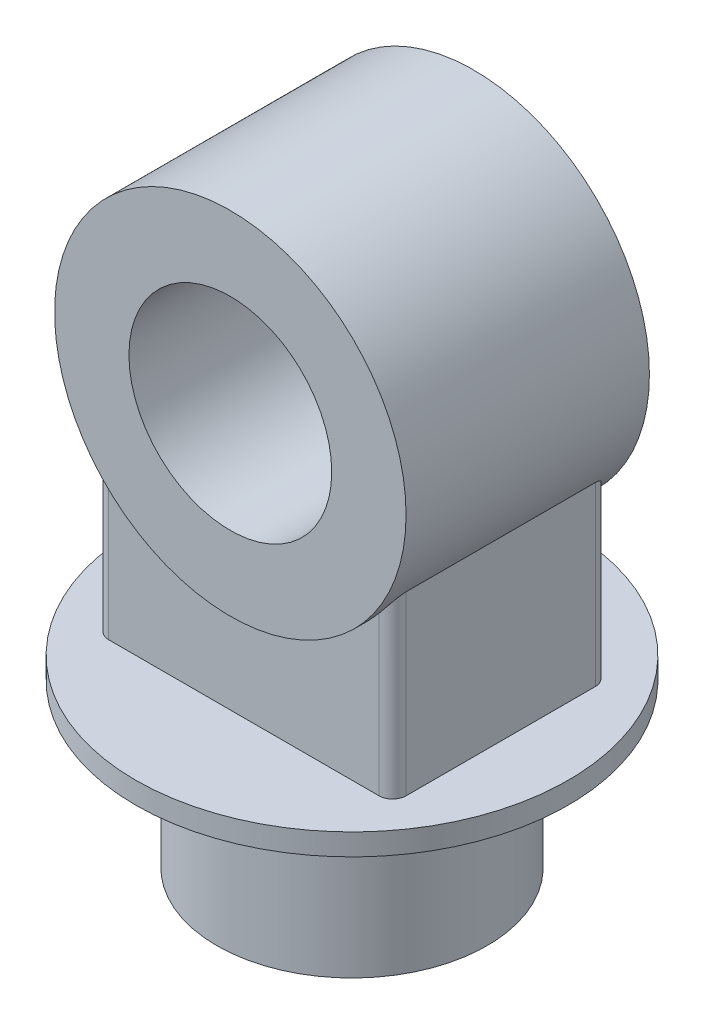
ISO-10303-21;
HEADER;
FILE_DESCRIPTION(('STEP AP214'),'2;1');
FILE_NAME('part.step','',(''),(''),'','','');
FILE_SCHEMA(('AUTOMOTIVE_DESIGN { 1 0 10303 214 1 1 1 1 }'));
ENDSEC;
DATA;
#1=APPLICATION_CONTEXT('core data for automotive mechanical design processes');
#2=APPLICATION_PROTOCOL_DEFINITION('international standard','automotive_design',2000,#1);
#3=PRODUCT_CONTEXT('',#1,'mechanical');
#4=PRODUCT('Part','Part','',(#3));
#5=PRODUCT_RELATED_PRODUCT_CATEGORY('part','',(#4));
#6=PRODUCT_DEFINITION_FORMATION('','',#4);
#7=PRODUCT_DEFINITION_CONTEXT('part definition',#1,'design');
#8=PRODUCT_DEFINITION('design','',#6,#7);
#9=PRODUCT_DEFINITION_SHAPE('','',#8);
#10=(LENGTH_UNIT() NAMED_UNIT(*) SI_UNIT(.MILLI.,.METRE.));
#11=(NAMED_UNIT(*) PLANE_ANGLE_UNIT() SI_UNIT($,.RADIAN.));
#12=(NAMED_UNIT(*) SI_UNIT($,.STERADIAN.) SOLID_ANGLE_UNIT());
#13=UNCERTAINTY_MEASURE_WITH_UNIT(LENGTH_MEASURE(1.E-05),#10,'distance_accuracy_value','');
#14=(GEOMETRIC_REPRESENTATION_CONTEXT(3) GLOBAL_UNCERTAINTY_ASSIGNED_CONTEXT((#13)) GLOBAL_UNIT_ASSIGNED_CONTEXT((#10,
#11,#12)) REPRESENTATION_CONTEXT('',''));
#15=CARTESIAN_POINT('',(0.,0.,0.));
#16=DIRECTION('',(0.,0.,1.));
#17=DIRECTION('',(1.,0.,0.));
#18=AXIS2_PLACEMENT_3D('',#15,#16,#17);
#19=CARTESIAN_POINT('',(0.,120.,0.));
#20=DIRECTION('',(0.,-1.,0.));
#21=DIRECTION('',(0.,0.,-1.));
#22=AXIS2_PLACEMENT_3D('',#19,#20,#21);
#23=CYLINDRICAL_SURFACE('',#22,100.);
#24=CARTESIAN_POINT('',(0.,120.,0.));
#25=DIRECTION('',(0.,1.,0.));
#26=DIRECTION('',(0.,0.,1.));
#27=AXIS2_PLACEMENT_3D('',#24,#25,#26);
#28=CIRCLE('',#27,100.);
#29=CARTESIAN_POINT('',(0.,120.,100.));
#30=VERTEX_POINT('',#29);
#31=EDGE_CURVE('E141',#30,#30,#28,.T.);
#32=ORIENTED_EDGE('',*,*,#31,.F.);
#33=EDGE_LOOP('',(#32));
#34=FACE_BOUND('',#33,.T.);
#35=CARTESIAN_POINT('',(0.,0.,0.));
#36=DIRECTION('',(0.,1.,0.));
#37=DIRECTION('',(0.,0.,1.));
#38=AXIS2_PLACEMENT_3D('',#35,#36,#37);
#39=CIRCLE('',#38,100.);
#40=CARTESIAN_POINT('',(0.,0.,100.));
#41=VERTEX_POINT('',#40);
#42=EDGE_CURVE('E218',#41,#41,#39,.T.);
#43=ORIENTED_EDGE('',*,*,#42,.T.);
#44=EDGE_LOOP('',(#43));
#45=FACE_BOUND('',#44,.T.);
#46=ADVANCED_FACE('F39',(#34,#45),#23,.T.);
#47=CARTESIAN_POINT('',(0.,0.,0.));
#48=DIRECTION('',(0.,1.,0.));
#49=DIRECTION('',(0.,0.,1.));
#50=AXIS2_PLACEMENT_3D('',#47,#48,#49);
#51=PLANE('',#50);
#52=ORIENTED_EDGE('',*,*,#42,.F.);
#53=EDGE_LOOP('',(#52));
#54=FACE_BOUND('',#53,.T.);
#55=ADVANCED_FACE('F206',(#54),#51,.F.);
#56=CARTESIAN_POINT('',(0.,136.,0.));
#57=DIRECTION('',(0.,-1.,0.));
#58=DIRECTION('',(0.,0.,-1.));
#59=AXIS2_PLACEMENT_3D('',#56,#57,#58);
#60=CYLINDRICAL_SURFACE('',#59,160.);
#61=CARTESIAN_POINT('',(0.,136.,0.));
#62=DIRECTION('',(0.,1.,0.));
#63=DIRECTION('',(0.,0.,1.));
#64=AXIS2_PLACEMENT_3D('',#61,#62,#63);
#65=CIRCLE('',#64,160.);
#66=CARTESIAN_POINT('',(0.,136.,160.));
#67=VERTEX_POINT('',#66);
#68=EDGE_CURVE('E219',#67,#67,#65,.T.);
#69=ORIENTED_EDGE('',*,*,#68,.F.);
#70=EDGE_LOOP('',(#69));
#71=FACE_BOUND('',#70,.T.);
#72=CARTESIAN_POINT('',(0.,120.,0.));
#73=DIRECTION('',(0.,1.,0.));
#74=DIRECTION('',(0.,0.,1.));
#75=AXIS2_PLACEMENT_3D('',#72,#73,#74);
#76=CIRCLE('',#75,160.);
#77=CARTESIAN_POINT('',(0.,120.,160.));
#78=VERTEX_POINT('',#77);
#79=EDGE_CURVE('E222',#78,#78,#76,.T.);
#80=ORIENTED_EDGE('',*,*,#79,.T.);
#81=EDGE_LOOP('',(#80));
#82=FACE_BOUND('',#81,.T.);
#83=ADVANCED_FACE('F211',(#71,#82),#60,.T.);
#84=CARTESIAN_POINT('',(0.,136.,0.));
#85=DIRECTION('',(0.,1.,0.));
#86=DIRECTION('',(0.,0.,1.));
#87=AXIS2_PLACEMENT_3D('',#84,#85,#86);
#88=PLANE('',#87);
#89=DIRECTION('',(0.,0.,-1.));
#90=VECTOR('',#89,1.);
#91=CARTESIAN_POINT('',(110.,136.,-80.));
#92=LINE('',#91,#90);
#93=CARTESIAN_POINT('',(110.,136.,70.));
#94=VERTEX_POINT('',#93);
#95=CARTESIAN_POINT('',(110.,136.,-70.));
#96=VERTEX_POINT('',#95);
#97=EDGE_CURVE('E226',#94,#96,#92,.T.);
#98=ORIENTED_EDGE('',*,*,#97,.F.);
#99=CARTESIAN_POINT('',(100.,136.,70.));
#100=DIRECTION('',(0.,1.,0.));
#101=DIRECTION('',(0.,0.,1.));
#102=AXIS2_PLACEMENT_3D('',#99,#100,#101);
#103=CIRCLE('',#102,10.);
#104=CARTESIAN_POINT('',(100.,136.,80.));
#105=VERTEX_POINT('',#104);
#106=EDGE_CURVE('E122',#94,#105,#103,.F.);
#107=ORIENTED_EDGE('',*,*,#106,.T.);
#108=DIRECTION('',(1.,0.,0.));
#109=VECTOR('',#108,1.);
#110=CARTESIAN_POINT('',(-110.,136.,80.));
#111=LINE('',#110,#109);
#112=CARTESIAN_POINT('',(-100.,136.,80.));
#113=VERTEX_POINT('',#112);
#114=EDGE_CURVE('E231',#113,#105,#111,.T.);
#115=ORIENTED_EDGE('',*,*,#114,.F.);
#116=CARTESIAN_POINT('',(-100.,136.,70.));
#117=DIRECTION('',(0.,1.,0.));
#118=DIRECTION('',(0.,0.,1.));
#119=AXIS2_PLACEMENT_3D('',#116,#117,#118);
#120=CIRCLE('',#119,10.);
#121=CARTESIAN_POINT('',(-110.,136.,70.));
#122=VERTEX_POINT('',#121);
#123=EDGE_CURVE('E53',#113,#122,#120,.F.);
#124=ORIENTED_EDGE('',*,*,#123,.T.);
#125=DIRECTION('',(0.,0.,1.));
#126=VECTOR('',#125,1.);
#127=CARTESIAN_POINT('',(-110.,136.,-80.));
#128=LINE('',#127,#126);
#129=CARTESIAN_POINT('',(-110.,136.,-70.));
#130=VERTEX_POINT('',#129);
#131=EDGE_CURVE('E234',#130,#122,#128,.T.);
#132=ORIENTED_EDGE('',*,*,#131,.F.);
#133=CARTESIAN_POINT('',(-100.,136.,-70.));
#134=DIRECTION('',(0.,1.,0.));
#135=DIRECTION('',(0.,0.,1.));
#136=AXIS2_PLACEMENT_3D('',#133,#134,#135);
#137=CIRCLE('',#136,10.);
#138=CARTESIAN_POINT('',(-100.,136.,-80.));
#139=VERTEX_POINT('',#138);
#140=EDGE_CURVE('E67',#130,#139,#137,.F.);
#141=ORIENTED_EDGE('',*,*,#140,.T.);
#142=DIRECTION('',(-1.,0.,0.));
#143=VECTOR('',#142,1.);
#144=CARTESIAN_POINT('',(-110.,136.,-80.));
#145=LINE('',#144,#143);
#146=CARTESIAN_POINT('',(100.,136.,-80.));
#147=VERTEX_POINT('',#146);
#148=EDGE_CURVE('E132',#147,#139,#145,.T.);
#149=ORIENTED_EDGE('',*,*,#148,.F.);
#150=CARTESIAN_POINT('',(100.,136.,-70.));
#151=DIRECTION('',(0.,1.,0.));
#152=DIRECTION('',(0.,0.,1.));
#153=AXIS2_PLACEMENT_3D('',#150,#151,#152);
#154=CIRCLE('',#153,10.);
#155=EDGE_CURVE('E121',#147,#96,#154,.F.);
#156=ORIENTED_EDGE('',*,*,#155,.T.);
#157=EDGE_LOOP('',(#98,#107,#115,#124,#132,#141,#149,#156));
#158=FACE_BOUND('',#157,.T.);
#159=ORIENTED_EDGE('',*,*,#68,.T.);
#160=EDGE_LOOP('',(#159));
#161=FACE_BOUND('',#160,.T.);
#162=ADVANCED_FACE('F348',(#158,#161),#88,.T.);
#163=CARTESIAN_POINT('',(0.,120.,0.));
#164=DIRECTION('',(0.,1.,0.));
#165=DIRECTION('',(0.,0.,1.));
#166=AXIS2_PLACEMENT_3D('',#163,#164,#165);
#167=PLANE('',#166);
#168=ORIENTED_EDGE('',*,*,#31,.T.);
#169=EDGE_LOOP('',(#168));
#170=FACE_BOUND('',#169,.T.);
#171=ORIENTED_EDGE('',*,*,#79,.F.);
#172=EDGE_LOOP('',(#171));
#173=FACE_BOUND('',#172,.T.);
#174=ADVANCED_FACE('F325',(#170,#173),#167,.F.);
#175=CARTESIAN_POINT('',(-110.,466.002,-80.));
#176=DIRECTION('',(0.,0.,1.));
#177=DIRECTION('',(1.,0.,0.));
#178=AXIS2_PLACEMENT_3D('',#175,#176,#177);
#179=PLANE('',#178);
#180=CARTESIAN_POINT('',(0.,336.,-80.));
#181=DIRECTION('',(0.,0.,1.));
#182=DIRECTION('',(1.,0.,0.));
#183=AXIS2_PLACEMENT_3D('',#180,#181,#182);
#184=CIRCLE('',#183,130.);
#185=CARTESIAN_POINT('',(100.,252.933761370819,-80.));
#186=VERTEX_POINT('',#185);
#187=CARTESIAN_POINT('',(-100.,252.933761370819,-80.));
#188=VERTEX_POINT('',#187);
#189=EDGE_CURVE('E133',#186,#188,#184,.F.);
#190=ORIENTED_EDGE('',*,*,#189,.F.);
#191=DIRECTION('',(0.,-1.,0.));
#192=VECTOR('',#191,1.);
#193=CARTESIAN_POINT('',(100.,466.002,-80.));
#194=LINE('',#193,#192);
#195=EDGE_CURVE('E148',#186,#147,#194,.T.);
#196=ORIENTED_EDGE('',*,*,#195,.T.);
#197=ORIENTED_EDGE('',*,*,#148,.T.);
#198=DIRECTION('',(0.,-1.,0.));
#199=VECTOR('',#198,1.);
#200=CARTESIAN_POINT('',(-100.,466.002,-80.));
#201=LINE('',#200,#199);
#202=EDGE_CURVE('E146',#139,#188,#201,.F.);
#203=ORIENTED_EDGE('',*,*,#202,.T.);
#204=EDGE_LOOP('',(#190,#196,#197,#203));
#205=FACE_BOUND('',#204,.T.);
#206=ADVANCED_FACE('F318',(#205),#179,.F.);
#207=CARTESIAN_POINT('',(110.,466.002,-80.));
#208=DIRECTION('',(-1.,0.,0.));
#209=DIRECTION('',(0.,0.,1.));
#210=AXIS2_PLACEMENT_3D('',#207,#208,#209);
#211=PLANE('',#210);
#212=DIRECTION('',(0.,0.,-1.));
#213=VECTOR('',#212,1.);
#214=CARTESIAN_POINT('',(110.,266.717967697245,90.));
#215=LINE('',#214,#213);
#216=CARTESIAN_POINT('',(110.,266.717967697245,70.));
#217=VERTEX_POINT('',#216);
#218=CARTESIAN_POINT('',(110.,266.717967697245,-69.9999999999999));
#219=VERTEX_POINT('',#218);
#220=EDGE_CURVE('E114',#217,#219,#215,.T.);
#221=ORIENTED_EDGE('',*,*,#220,.F.);
#222=DIRECTION('',(0.,-1.,0.));
#223=VECTOR('',#222,1.);
#224=CARTESIAN_POINT('',(110.,466.002,70.));
#225=LINE('',#224,#223);
#226=EDGE_CURVE('E128',#217,#94,#225,.T.);
#227=ORIENTED_EDGE('',*,*,#226,.T.);
#228=ORIENTED_EDGE('',*,*,#97,.T.);
#229=DIRECTION('',(0.,-1.,0.));
#230=VECTOR('',#229,1.);
#231=CARTESIAN_POINT('',(110.,466.002,-70.));
#232=LINE('',#231,#230);
#233=EDGE_CURVE('E131',#96,#219,#232,.F.);
#234=ORIENTED_EDGE('',*,*,#233,.T.);
#235=EDGE_LOOP('',(#221,#227,#228,#234));
#236=FACE_BOUND('',#235,.T.);
#237=ADVANCED_FACE('F126',(#236),#211,.F.);
#238=CARTESIAN_POINT('',(-110.,466.002,-80.));
#239=DIRECTION('',(1.,0.,0.));
#240=DIRECTION('',(0.,0.,-1.));
#241=AXIS2_PLACEMENT_3D('',#238,#239,#240);
#242=PLANE('',#241);
#243=DIRECTION('',(0.,0.,-1.));
#244=VECTOR('',#243,1.);
#245=CARTESIAN_POINT('',(-110.,266.717967697245,90.));
#246=LINE('',#245,#244);
#247=CARTESIAN_POINT('',(-110.,266.717967697245,-70.));
#248=VERTEX_POINT('',#247);
#249=CARTESIAN_POINT('',(-110.,266.717967697245,70.));
#250=VERTEX_POINT('',#249);
#251=EDGE_CURVE('E193',#248,#250,#246,.F.);
#252=ORIENTED_EDGE('',*,*,#251,.F.);
#253=DIRECTION('',(0.,-1.,0.));
#254=VECTOR('',#253,1.);
#255=CARTESIAN_POINT('',(-110.,466.002,-70.));
#256=LINE('',#255,#254);
#257=EDGE_CURVE('E153',#248,#130,#256,.T.);
#258=ORIENTED_EDGE('',*,*,#257,.T.);
#259=ORIENTED_EDGE('',*,*,#131,.T.);
#260=DIRECTION('',(0.,-1.,0.));
#261=VECTOR('',#260,1.);
#262=CARTESIAN_POINT('',(-110.,466.002,70.));
#263=LINE('',#262,#261);
#264=EDGE_CURVE('E151',#122,#250,#263,.F.);
#265=ORIENTED_EDGE('',*,*,#264,.T.);
#266=EDGE_LOOP('',(#252,#258,#259,#265));
#267=FACE_BOUND('',#266,.T.);
#268=ADVANCED_FACE('F197',(#267),#242,.F.);
#269=CARTESIAN_POINT('',(-110.,466.002,80.));
#270=DIRECTION('',(0.,0.,-1.));
#271=DIRECTION('',(-1.,0.,0.));
#272=AXIS2_PLACEMENT_3D('',#269,#270,#271);
#273=PLANE('',#272);
#274=ORIENTED_EDGE('',*,*,#114,.T.);
#275=DIRECTION('',(0.,-1.,0.));
#276=VECTOR('',#275,1.);
#277=CARTESIAN_POINT('',(100.,466.002,80.));
#278=LINE('',#277,#276);
#279=CARTESIAN_POINT('',(100.,252.933761370819,80.));
#280=VERTEX_POINT('',#279);
#281=EDGE_CURVE('E139',#105,#280,#278,.F.);
#282=ORIENTED_EDGE('',*,*,#281,.T.);
#283=CARTESIAN_POINT('',(0.,336.,80.));
#284=DIRECTION('',(0.,0.,-1.));
#285=DIRECTION('',(-1.,0.,0.));
#286=AXIS2_PLACEMENT_3D('',#283,#284,#285);
#287=CIRCLE('',#286,130.);
#288=CARTESIAN_POINT('',(-100.,252.933761370819,80.));
#289=VERTEX_POINT('',#288);
#290=EDGE_CURVE('E117',#289,#280,#287,.F.);
#291=ORIENTED_EDGE('',*,*,#290,.F.);
#292=DIRECTION('',(0.,-1.,0.));
#293=VECTOR('',#292,1.);
#294=CARTESIAN_POINT('',(-100.,466.002,80.));
#295=LINE('',#294,#293);
#296=EDGE_CURVE('E136',#289,#113,#295,.T.);
#297=ORIENTED_EDGE('',*,*,#296,.T.);
#298=EDGE_LOOP('',(#274,#282,#291,#297));
#299=FACE_BOUND('',#298,.T.);
#300=ADVANCED_FACE('F263',(#299),#273,.F.);
#301=CARTESIAN_POINT('',(0.,336.,90.));
#302=DIRECTION('',(0.,0.,-1.));
#303=DIRECTION('',(-1.,0.,0.));
#304=AXIS2_PLACEMENT_3D('',#301,#302,#303);
#305=CYLINDRICAL_SURFACE('',#304,130.);
#306=CARTESIAN_POINT('',(0.,336.,90.));
#307=DIRECTION('',(0.,0.,1.));
#308=DIRECTION('',(1.,0.,0.));
#309=AXIS2_PLACEMENT_3D('',#306,#307,#308);
#310=CIRCLE('',#309,130.);
#311=CARTESIAN_POINT('',(130.,336.,90.));
#312=VERTEX_POINT('',#311);
#313=EDGE_CURVE('E228',#312,#312,#310,.T.);
#314=ORIENTED_EDGE('',*,*,#313,.F.);
#315=EDGE_LOOP('',(#314));
#316=FACE_BOUND('',#315,.T.);
#317=CARTESIAN_POINT('',(0.,336.,-90.));
#318=DIRECTION('',(0.,0.,1.));
#319=DIRECTION('',(1.,0.,0.));
#320=AXIS2_PLACEMENT_3D('',#317,#318,#319);
#321=CIRCLE('',#320,130.);
#322=CARTESIAN_POINT('',(130.,336.,-90.));
#323=VERTEX_POINT('',#322);
#324=EDGE_CURVE('E239',#323,#323,#321,.T.);
#325=ORIENTED_EDGE('',*,*,#324,.T.);
#326=EDGE_LOOP('',(#325));
#327=FACE_BOUND('',#326,.T.);
#328=ORIENTED_EDGE('',*,*,#290,.T.);
#329=CARTESIAN_POINT('',(100.,252.933761370819,80.));
#330=CARTESIAN_POINT('',(100.223611151915,253.202952503255,79.9999830665315));
#331=CARTESIAN_POINT('',(100.446118360057,253.473036166024,79.9924995885085));
#332=CARTESIAN_POINT('',(100.888548742496,254.014496760122,79.9629173131463));
#333=CARTESIAN_POINT('',(101.108472043759,254.285873626978,79.9408192370116));
#334=CARTESIAN_POINT('',(101.545586290072,254.829711400373,79.8822979337703));
#335=CARTESIAN_POINT('',(101.76277446753,255.102173087004,79.8458612385231));
#336=CARTESIAN_POINT('',(102.193849033468,255.647413797012,79.7588609087488));
#337=CARTESIAN_POINT('',(102.407735374993,255.920192824843,79.7082970735217));
#338=CARTESIAN_POINT('',(103.048408055095,256.74400885936,79.5343891784366));
#339=CARTESIAN_POINT('',(103.469748368072,257.294974230618,79.3894263280958));
#340=CARTESIAN_POINT('',(104.088382224678,258.117224843771,79.1288060997198));
#341=CARTESIAN_POINT('',(104.292337034927,258.39057162742,79.0347525474725));
#342=CARTESIAN_POINT('',(104.695498702643,258.935304765081,78.8319429710982));
#343=CARTESIAN_POINT('',(104.894706004332,259.206691300842,78.7231883289499));
#344=CARTESIAN_POINT('',(105.336170271764,259.812965668139,78.4620472638272));
#345=CARTESIAN_POINT('',(105.577006541077,260.147108038148,78.3055009036513));
#346=CARTESIAN_POINT('',(106.049660949871,260.809343252621,77.967808626391));
#347=CARTESIAN_POINT('',(106.281479043935,261.137436066616,77.7866625854443));
#348=CARTESIAN_POINT('',(106.734152264033,261.784259610706,77.3986376161628));
#349=CARTESIAN_POINT('',(106.955036134368,262.103013877598,77.1918317878757));
#350=CARTESIAN_POINT('',(107.384708325122,262.728803605627,76.749894392022));
#351=CARTESIAN_POINT('',(107.593501627276,263.035843875289,76.5147746155492));
#352=CARTESIAN_POINT('',(107.921279015409,263.522080966666,76.1068757916446));
#353=CARTESIAN_POINT('',(108.044709884718,263.706240813682,75.9435605188263));
#354=CARTESIAN_POINT('',(108.284949666933,264.066582834907,75.6038296157538));
#355=CARTESIAN_POINT('',(108.401760304956,264.242767084986,75.4274174262628));
#356=CARTESIAN_POINT('',(108.627683741988,264.585236991633,75.0605773993746));
#357=CARTESIAN_POINT('',(108.736797961361,264.751524473746,74.8701521613912));
#358=CARTESIAN_POINT('',(108.945874410432,265.071634412635,74.4745306992528));
#359=CARTESIAN_POINT('',(109.04583974995,265.225461102935,74.2693395369045));
#360=CARTESIAN_POINT('',(109.274660386151,265.579056080623,73.7536743100227));
#361=CARTESIAN_POINT('',(109.398046362816,265.771031349643,73.4351396850742));
#362=CARTESIAN_POINT('',(109.561336457207,266.026263049992,72.9345418523035));
#363=CARTESIAN_POINT('',(109.612072269395,266.105785634321,72.7641622498837));
#364=CARTESIAN_POINT('',(109.705421847597,266.25239837099,72.4160328323222));
#365=CARTESIAN_POINT('',(109.748040656091,266.319496241142,72.2382876769632));
#366=CARTESIAN_POINT('',(109.820262744001,266.433384610412,71.8947331689276));
#367=CARTESIAN_POINT('',(109.850752312767,266.481551609067,71.729567610939));
#368=CARTESIAN_POINT('',(109.903691363628,266.565274678987,71.3948451418076));
#369=CARTESIAN_POINT('',(109.926143541964,266.600834979285,71.2252897238033));
#370=CARTESIAN_POINT('',(109.962659042777,266.658707696818,70.8807814271977));
#371=CARTESIAN_POINT('',(109.976613864032,266.680848750137,70.7057875562757));
#372=CARTESIAN_POINT('',(109.99061964662,266.703076138542,70.4419386674803));
#373=CARTESIAN_POINT('',(109.99413386492,266.708654625171,70.3536902139711));
#374=CARTESIAN_POINT('',(109.998824989492,266.716102079045,70.1769662160103));
#375=CARTESIAN_POINT('',(110.000001659485,266.717970671296,70.088490649507));
#376=CARTESIAN_POINT('',(110.,266.717967697245,70.));
#377=B_SPLINE_CURVE_WITH_KNOTS('',3,(#329,#330,#331,#332,#333,#334,#335,#336,#337,#338,#339,
#340,#341,#342,#343,#344,#345,#346,#347,#348,#349,#350,#351,#352,#353,#354,#355,#356,#357,#358,
#359,#360,#361,#362,#363,#364,#365,#366,#367,#368,#369,#370,#371,#372,#373,#374,#375,#376),
.UNSPECIFIED.,.F.,.F.,(4,2,2,2,2,2,2,2,2,2,2,2,2,2,2,2,2,2,2,2,2,2,2,4),(0.,1.04974156507773,
2.0994313311457,3.15010942417266,4.20080244462032,6.32356278933856,7.38465211465323,
8.44564176134495,9.76677685539396,11.087918601761,12.4053795382949,13.7222937149077,
14.5479419827463,15.3733741023698,16.1986534888326,17.023651302289,18.194686650492,
18.7783719827905,19.3616935243415,19.8852298594992,20.408590403038,20.9385006934629,
21.2038887699912,21.4693036704869),.UNSPECIFIED.);
#378=EDGE_CURVE('E111',#280,#217,#377,.T.);
#379=ORIENTED_EDGE('',*,*,#378,.T.);
#380=ORIENTED_EDGE('',*,*,#220,.T.);
#381=CARTESIAN_POINT('',(110.,266.717967697245,-70.));
#382=CARTESIAN_POINT('',(110.000033683462,266.718025852698,-70.1614230595313));
#383=CARTESIAN_POINT('',(109.996092792414,266.711764254296,-70.3228118197691));
#384=CARTESIAN_POINT('',(109.980519982779,266.687045880384,-70.6441123999957));
#385=CARTESIAN_POINT('',(109.968896213713,266.668602027069,-70.8040256031146));
#386=CARTESIAN_POINT('',(109.938376398954,266.620217986395,-71.1196424551221));
#387=CARTESIAN_POINT('',(109.919558261622,266.590400967593,-71.2753727040436));
#388=CARTESIAN_POINT('',(109.875071558334,266.52000006118,-71.5834085562726));
#389=CARTESIAN_POINT('',(109.849400846184,266.479412800404,-71.7357130704249));
#390=CARTESIAN_POINT('',(109.784772267017,266.377386983169,-72.0722520040974));
#391=CARTESIAN_POINT('',(109.744103525393,266.313281105855,-72.2553511890568));
#392=CARTESIAN_POINT('',(109.654040532803,266.171650231929,-72.6141464391851));
#393=CARTESIAN_POINT('',(109.604640075501,266.094115691273,-72.7898371277864));
#394=CARTESIAN_POINT('',(109.497968805892,265.927147418338,-73.133872391345));
#395=CARTESIAN_POINT('',(109.440667457039,265.837667562915,-73.302184951541));
#396=CARTESIAN_POINT('',(109.319341126161,265.648779195145,-73.6304969218558));
#397=CARTESIAN_POINT('',(109.25531768694,265.549372961282,-73.7904982269664));
#398=CARTESIAN_POINT('',(109.085069343255,265.285901292919,-74.1868876463209));
#399=CARTESIAN_POINT('',(108.974781990569,265.115997241409,-74.4176642111939));
#400=CARTESIAN_POINT('',(108.742772943656,264.76058359918,-74.8607110351426));
#401=CARTESIAN_POINT('',(108.621044869784,264.575065307649,-75.072970840064));
#402=CARTESIAN_POINT('',(108.36794946479,264.19164129378,-75.4804206329535));
#403=CARTESIAN_POINT('',(108.236568322626,263.993717884812,-75.6755852518652));
#404=CARTESIAN_POINT('',(107.965814499919,263.588382733387,-76.0497203250662));
#405=CARTESIAN_POINT('',(107.826442440892,263.380971729107,-76.2286920360201));
#406=CARTESIAN_POINT('',(107.56145650763,262.989174407744,-76.5468161797372));
#407=CARTESIAN_POINT('',(107.436764821801,262.805791987749,-76.6879854690674));
#408=CARTESIAN_POINT('',(107.182869679799,262.434497987953,-76.9599552926783));
#409=CARTESIAN_POINT('',(107.053665586411,262.24658576965,-77.0907543539386));
#410=CARTESIAN_POINT('',(106.659844344167,261.677121003612,-77.4685356621902));
#411=CARTESIAN_POINT('',(106.389102445143,261.289965080353,-77.7008024816961));
#412=CARTESIAN_POINT('',(105.833418194946,260.504836154638,-78.129863631631));
#413=CARTESIAN_POINT('',(105.548442441802,260.106838810795,-78.3265689888296));
#414=CARTESIAN_POINT('',(104.96676628824,259.304344779382,-78.6860846955172));
#415=CARTESIAN_POINT('',(104.670068038633,258.899849292081,-78.8489012287858));
#416=CARTESIAN_POINT('',(104.024574509401,258.030646711215,-79.1623550419402));
#417=CARTESIAN_POINT('',(103.674248758637,257.565348460988,-79.3081944572228));
#418=CARTESIAN_POINT('',(102.961876677953,256.632523338709,-79.558756520093));
#419=CARTESIAN_POINT('',(102.599828734006,256.16499616738,-79.6634734792563));
#420=CARTESIAN_POINT('',(102.051092736822,255.466397204689,-79.7891645729388));
#421=CARTESIAN_POINT('',(101.868137468165,255.235094848973,-79.8257282191264));
#422=CARTESIAN_POINT('',(101.499966150616,254.77288550036,-79.8886289353229));
#423=CARTESIAN_POINT('',(101.314750133026,254.541978502041,-79.9149661467555));
#424=CARTESIAN_POINT('',(100.942320486513,254.080919722901,-79.9572665465168));
#425=CARTESIAN_POINT('',(100.755107350153,253.850767773367,-79.9732322353467));
#426=CARTESIAN_POINT('',(100.378860262163,253.391449185777,-79.9945948234744));
#427=CARTESIAN_POINT('',(100.189826234412,253.162282589497,-79.9999912789888));
#428=CARTESIAN_POINT('',(99.9999999999999,252.933761370819,-80.));
#429=B_SPLINE_CURVE_WITH_KNOTS('',3,(#381,#382,#383,#384,#385,#386,#387,#388,#389,#390,#391,
#392,#393,#394,#395,#396,#397,#398,#399,#400,#401,#402,#403,#404,#405,#406,#407,#408,#409,#410,
#411,#412,#413,#414,#415,#416,#417,#418,#419,#420,#421,#422,#423,#424,#425,#426,#427,#428),
.UNSPECIFIED.,.F.,.F.,(4,2,2,2,2,2,2,2,2,2,2,2,2,2,2,2,2,2,2,2,2,2,2,4),(0.,0.484045005923072,
0.967577389145415,1.44601544684507,1.92460352520314,2.51835043890465,3.11252108624073,
3.7090561398874,4.30545457926274,5.22516595363372,6.14539326092326,7.06696382284195,
7.98846280401968,8.77680092000542,9.56525081419897,11.1426900482287,12.7240229357799,
14.305067020047,16.1047501551828,17.9046821508918,18.7960435003637,19.6873925225409,
20.5785265668948,21.4696980275819),.UNSPECIFIED.);
#430=EDGE_CURVE('E177',#219,#186,#429,.T.);
#431=ORIENTED_EDGE('',*,*,#430,.T.);
#432=ORIENTED_EDGE('',*,*,#189,.T.);
#433=CARTESIAN_POINT('',(-100.,252.933761370819,-80.));
#434=CARTESIAN_POINT('',(-100.223611151915,253.202952503255,-79.9999830665315));
#435=CARTESIAN_POINT('',(-100.446118360057,253.473036166024,-79.9924995885085));
#436=CARTESIAN_POINT('',(-100.888548742496,254.014496760122,-79.9629173131463));
#437=CARTESIAN_POINT('',(-101.10847204376,254.285873626978,-79.9408192370116));
#438=CARTESIAN_POINT('',(-101.545586290072,254.829711400373,-79.8822979337703));
#439=CARTESIAN_POINT('',(-101.76277446753,255.102173087004,-79.8458612385231));
#440=CARTESIAN_POINT('',(-102.193849033468,255.647413797012,-79.7588609087488));
#441=CARTESIAN_POINT('',(-102.407735374993,255.920192824843,-79.7082970735217));
#442=CARTESIAN_POINT('',(-103.048408055095,256.74400885936,-79.5343891784366));
#443=CARTESIAN_POINT('',(-103.469748368072,257.294974230618,-79.3894263280958));
#444=CARTESIAN_POINT('',(-104.088382224678,258.117224843771,-79.1288060997198));
#445=CARTESIAN_POINT('',(-104.292337034927,258.39057162742,-79.0347525474725));
#446=CARTESIAN_POINT('',(-104.695498702643,258.935304765081,-78.8319429710982));
#447=CARTESIAN_POINT('',(-104.894706004332,259.206691300842,-78.7231883289499));
#448=CARTESIAN_POINT('',(-105.336170271764,259.812965668139,-78.4620472638272));
#449=CARTESIAN_POINT('',(-105.577006541077,260.147108038148,-78.3055009036513));
#450=CARTESIAN_POINT('',(-106.049660949871,260.809343252621,-77.967808626391));
#451=CARTESIAN_POINT('',(-106.281479043935,261.137436066616,-77.7866625854443));
#452=CARTESIAN_POINT('',(-106.734152264033,261.784259610706,-77.3986376161628));
#453=CARTESIAN_POINT('',(-106.955036134368,262.103013877599,-77.1918317878757));
#454=CARTESIAN_POINT('',(-107.384708325122,262.728803605627,-76.749894392022));
#455=CARTESIAN_POINT('',(-107.593501627276,263.035843875289,-76.5147746155492));
#456=CARTESIAN_POINT('',(-107.921279015409,263.522080966667,-76.1068757916446));
#457=CARTESIAN_POINT('',(-108.044709884718,263.706240813682,-75.9435605188263));
#458=CARTESIAN_POINT('',(-108.284949666933,264.066582834907,-75.6038296157538));
#459=CARTESIAN_POINT('',(-108.401760304956,264.242767084987,-75.4274174262628));
#460=CARTESIAN_POINT('',(-108.627683741988,264.585236991633,-75.0605773993746));
#461=CARTESIAN_POINT('',(-108.736797961361,264.751524473746,-74.8701521613912));
#462=CARTESIAN_POINT('',(-108.945874410432,265.071634412635,-74.4745306992527));
#463=CARTESIAN_POINT('',(-109.04583974995,265.225461102935,-74.2693395369045));
#464=CARTESIAN_POINT('',(-109.274660386151,265.579056080623,-73.7536743100227));
#465=CARTESIAN_POINT('',(-109.398046362816,265.771031349643,-73.4351396850742));
#466=CARTESIAN_POINT('',(-109.561336457207,266.026263049993,-72.9345418523035));
#467=CARTESIAN_POINT('',(-109.612072269395,266.105785634321,-72.7641622498836));
#468=CARTESIAN_POINT('',(-109.705421847597,266.25239837099,-72.4160328323222));
#469=CARTESIAN_POINT('',(-109.748040656091,266.319496241142,-72.2382876769632));
#470=CARTESIAN_POINT('',(-109.820262744001,266.433384610412,-71.8947331689276));
#471=CARTESIAN_POINT('',(-109.850752312767,266.481551609067,-71.729567610939));
#472=CARTESIAN_POINT('',(-109.903691363628,266.565274678988,-71.3948451418076));
#473=CARTESIAN_POINT('',(-109.926143541964,266.600834979285,-71.2252897238033));
#474=CARTESIAN_POINT('',(-109.962659042777,266.658707696818,-70.8807814271977));
#475=CARTESIAN_POINT('',(-109.976613864032,266.680848750137,-70.7057875562757));
#476=CARTESIAN_POINT('',(-109.99061964662,266.703076138542,-70.4419386674803));
#477=CARTESIAN_POINT('',(-109.99413386492,266.708654625171,-70.3536902139711));
#478=CARTESIAN_POINT('',(-109.998824989492,266.716102079046,-70.1769662160102));
#479=CARTESIAN_POINT('',(-110.000001659485,266.717970671296,-70.0884906495071));
#480=CARTESIAN_POINT('',(-110.,266.717967697245,-70.));
#481=B_SPLINE_CURVE_WITH_KNOTS('',3,(#433,#434,#435,#436,#437,#438,#439,#440,#441,#442,#443,
#444,#445,#446,#447,#448,#449,#450,#451,#452,#453,#454,#455,#456,#457,#458,#459,#460,#461,#462,
#463,#464,#465,#466,#467,#468,#469,#470,#471,#472,#473,#474,#475,#476,#477,#478,#479,#480),
.UNSPECIFIED.,.F.,.F.,(4,2,2,2,2,2,2,2,2,2,2,2,2,2,2,2,2,2,2,2,2,2,2,4),(0.,1.04974156507777,
2.09943133114573,3.15010942417273,4.20080244462033,6.32356278933855,7.38465211465328,
8.44564176134501,9.76677685539399,11.087918601761,12.4053795382949,13.7222937149078,
14.5479419827464,15.3733741023699,16.1986534888326,17.023651302289,18.194686650492,
18.7783719827906,19.3616935243416,19.8852298594993,20.4085904030381,20.9385006934629,
21.2038887699912,21.4693036704869),.UNSPECIFIED.);
#482=EDGE_CURVE('E184',#188,#248,#481,.T.);
#483=ORIENTED_EDGE('',*,*,#482,.T.);
#484=ORIENTED_EDGE('',*,*,#251,.T.);
#485=CARTESIAN_POINT('',(-110.,266.717967697245,70.));
#486=CARTESIAN_POINT('',(-110.000033683462,266.718025852698,70.1614230595313));
#487=CARTESIAN_POINT('',(-109.996092792414,266.711764254296,70.3228118197691));
#488=CARTESIAN_POINT('',(-109.980519982779,266.687045880384,70.6441123999957));
#489=CARTESIAN_POINT('',(-109.968896213713,266.668602027069,70.8040256031146));
#490=CARTESIAN_POINT('',(-109.938376398954,266.620217986395,71.1196424551221));
#491=CARTESIAN_POINT('',(-109.919558261622,266.590400967593,71.2753727040436));
#492=CARTESIAN_POINT('',(-109.875071558334,266.52000006118,71.5834085562726));
#493=CARTESIAN_POINT('',(-109.849400846184,266.479412800404,71.7357130704249));
#494=CARTESIAN_POINT('',(-109.784772267017,266.377386983169,72.0722520040974));
#495=CARTESIAN_POINT('',(-109.744103525393,266.313281105856,72.2553511890568));
#496=CARTESIAN_POINT('',(-109.654040532803,266.17165023193,72.6141464391851));
#497=CARTESIAN_POINT('',(-109.604640075501,266.094115691273,72.7898371277865));
#498=CARTESIAN_POINT('',(-109.497968805892,265.927147418338,73.133872391345));
#499=CARTESIAN_POINT('',(-109.440667457039,265.837667562915,73.302184951541));
#500=CARTESIAN_POINT('',(-109.319341126161,265.648779195145,73.6304969218558));
#501=CARTESIAN_POINT('',(-109.25531768694,265.549372961282,73.7904982269664));
#502=CARTESIAN_POINT('',(-109.085069343255,265.28590129292,74.1868876463209));
#503=CARTESIAN_POINT('',(-108.974781990569,265.115997241409,74.4176642111939));
#504=CARTESIAN_POINT('',(-108.742772943656,264.76058359918,74.8607110351426));
#505=CARTESIAN_POINT('',(-108.621044869784,264.575065307649,75.072970840064));
#506=CARTESIAN_POINT('',(-108.36794946479,264.19164129378,75.4804206329535));
#507=CARTESIAN_POINT('',(-108.236568322626,263.993717884812,75.6755852518652));
#508=CARTESIAN_POINT('',(-107.965814499919,263.588382733387,76.0497203250661));
#509=CARTESIAN_POINT('',(-107.826442440892,263.380971729107,76.2286920360201));
#510=CARTESIAN_POINT('',(-107.56145650763,262.989174407744,76.5468161797372));
#511=CARTESIAN_POINT('',(-107.436764821801,262.805791987749,76.6879854690674));
#512=CARTESIAN_POINT('',(-107.182869679799,262.434497987953,76.9599552926783));
#513=CARTESIAN_POINT('',(-107.053665586411,262.24658576965,77.0907543539385));
#514=CARTESIAN_POINT('',(-106.659844344167,261.677121003612,77.4685356621901));
#515=CARTESIAN_POINT('',(-106.389102445143,261.289965080353,77.7008024816961));
#516=CARTESIAN_POINT('',(-105.833418194947,260.504836154638,78.129863631631));
#517=CARTESIAN_POINT('',(-105.548442441802,260.106838810795,78.3265689888296));
#518=CARTESIAN_POINT('',(-104.96676628824,259.304344779382,78.6860846955171));
#519=CARTESIAN_POINT('',(-104.670068038633,258.899849292081,78.8489012287858));
#520=CARTESIAN_POINT('',(-104.024574509401,258.030646711215,79.1623550419402));
#521=CARTESIAN_POINT('',(-103.674248758637,257.565348460988,79.3081944572228));
#522=CARTESIAN_POINT('',(-102.961876677953,256.632523338709,79.558756520093));
#523=CARTESIAN_POINT('',(-102.599828734006,256.16499616738,79.6634734792563));
#524=CARTESIAN_POINT('',(-102.051092736822,255.466397204689,79.7891645729387));
#525=CARTESIAN_POINT('',(-101.868137468165,255.235094848973,79.8257282191264));
#526=CARTESIAN_POINT('',(-101.499966150616,254.77288550036,79.8886289353229));
#527=CARTESIAN_POINT('',(-101.314750133026,254.541978502041,79.9149661467555));
#528=CARTESIAN_POINT('',(-100.942320486513,254.080919722901,79.9572665465168));
#529=CARTESIAN_POINT('',(-100.755107350153,253.850767773367,79.9732322353467));
#530=CARTESIAN_POINT('',(-100.378860262163,253.391449185777,79.9945948234744));
#531=CARTESIAN_POINT('',(-100.189826234412,253.162282589497,79.9999912789888));
#532=CARTESIAN_POINT('',(-100.,252.933761370819,80.));
#533=B_SPLINE_CURVE_WITH_KNOTS('',3,(#485,#486,#487,#488,#489,#490,#491,#492,#493,#494,#495,
#496,#497,#498,#499,#500,#501,#502,#503,#504,#505,#506,#507,#508,#509,#510,#511,#512,#513,#514,
#515,#516,#517,#518,#519,#520,#521,#522,#523,#524,#525,#526,#527,#528,#529,#530,#531,#532),
.UNSPECIFIED.,.F.,.F.,(4,2,2,2,2,2,2,2,2,2,2,2,2,2,2,2,2,2,2,2,2,2,2,4),(0.,0.484045005923082,
0.967577389145424,1.44601544684506,1.92460352520314,2.51835043890467,3.11252108624077,
3.7090561398874,4.30545457926273,5.22516595363374,6.14539326092328,7.0669638228419,
7.98846280401962,8.77680092000534,9.56525081419887,11.1426900482286,12.7240229357797,
14.305067020047,16.1047501551828,17.9046821508917,18.7960435003637,19.6873925225409,
20.5785265668947,21.4696980275819),.UNSPECIFIED.);
#534=EDGE_CURVE('E11',#250,#289,#533,.T.);
#535=ORIENTED_EDGE('',*,*,#534,.T.);
#536=EDGE_LOOP('',(#328,#379,#380,#431,#432,#483,#484,#535));
#537=FACE_BOUND('',#536,.T.);
#538=ADVANCED_FACE('F113',(#316,#327,#537),#305,.T.);
#539=CARTESIAN_POINT('',(0.,336.,90.));
#540=DIRECTION('',(0.,0.,1.));
#541=DIRECTION('',(1.,0.,0.));
#542=AXIS2_PLACEMENT_3D('',#539,#540,#541);
#543=PLANE('',#542);
#544=ORIENTED_EDGE('',*,*,#313,.T.);
#545=EDGE_LOOP('',(#544));
#546=FACE_BOUND('',#545,.T.);
#547=CARTESIAN_POINT('',(0.,336.,90.));
#548=DIRECTION('',(0.,0.,1.));
#549=DIRECTION('',(1.,0.,0.));
#550=AXIS2_PLACEMENT_3D('',#547,#548,#549);
#551=CIRCLE('',#550,75.);
#552=CARTESIAN_POINT('',(-75.,336.,90.));
#553=VERTEX_POINT('',#552);
#554=EDGE_CURVE('E242',#553,#553,#551,.T.);
#555=ORIENTED_EDGE('',*,*,#554,.F.);
#556=EDGE_LOOP('',(#555));
#557=FACE_BOUND('',#556,.T.);
#558=ADVANCED_FACE('F253',(#546,#557),#543,.T.);
#559=CARTESIAN_POINT('',(0.,336.,-90.));
#560=DIRECTION('',(0.,0.,1.));
#561=DIRECTION('',(1.,0.,0.));
#562=AXIS2_PLACEMENT_3D('',#559,#560,#561);
#563=PLANE('',#562);
#564=ORIENTED_EDGE('',*,*,#324,.F.);
#565=EDGE_LOOP('',(#564));
#566=FACE_BOUND('',#565,.T.);
#567=CARTESIAN_POINT('',(0.,336.,-90.));
#568=DIRECTION('',(0.,0.,1.));
#569=DIRECTION('',(1.,0.,0.));
#570=AXIS2_PLACEMENT_3D('',#567,#568,#569);
#571=CIRCLE('',#570,75.);
#572=CARTESIAN_POINT('',(-75.,336.,-90.));
#573=VERTEX_POINT('',#572);
#574=EDGE_CURVE('E245',#573,#573,#571,.T.);
#575=ORIENTED_EDGE('',*,*,#574,.T.);
#576=EDGE_LOOP('',(#575));
#577=FACE_BOUND('',#576,.T.);
#578=ADVANCED_FACE('F255',(#566,#577),#563,.F.);
#579=CARTESIAN_POINT('',(0.,336.,90.));
#580=DIRECTION('',(0.,0.,-1.));
#581=DIRECTION('',(-1.,0.,0.));
#582=AXIS2_PLACEMENT_3D('',#579,#580,#581);
#583=CYLINDRICAL_SURFACE('',#582,75.);
#584=CARTESIAN_POINT('',(-75.,336.,90.));
#585=CARTESIAN_POINT('',(-75.,336.,88.125));
#586=CARTESIAN_POINT('',(-75.,336.,86.25));
#587=CARTESIAN_POINT('',(-75.,336.,82.5));
#588=CARTESIAN_POINT('',(-75.,336.,80.625));
#589=CARTESIAN_POINT('',(-75.,336.,76.875));
#590=CARTESIAN_POINT('',(-75.,336.,75.));
#591=CARTESIAN_POINT('',(-75.,336.,71.25));
#592=CARTESIAN_POINT('',(-75.,336.,69.375));
#593=CARTESIAN_POINT('',(-75.,336.,65.625));
#594=CARTESIAN_POINT('',(-75.,336.,63.75));
#595=CARTESIAN_POINT('',(-75.,336.,60.));
#596=CARTESIAN_POINT('',(-75.,336.,58.125));
#597=CARTESIAN_POINT('',(-75.,336.,54.375));
#598=CARTESIAN_POINT('',(-75.,336.,52.5));
#599=CARTESIAN_POINT('',(-75.,336.,48.75));
#600=CARTESIAN_POINT('',(-75.,336.,46.875));
#601=CARTESIAN_POINT('',(-75.,336.,43.125));
#602=CARTESIAN_POINT('',(-75.,336.,41.25));
#603=CARTESIAN_POINT('',(-75.,336.,37.5));
#604=CARTESIAN_POINT('',(-75.,336.,35.625));
#605=CARTESIAN_POINT('',(-75.,336.,31.875));
#606=CARTESIAN_POINT('',(-75.,336.,30.));
#607=CARTESIAN_POINT('',(-75.,336.,26.25));
#608=CARTESIAN_POINT('',(-75.,336.,24.375));
#609=CARTESIAN_POINT('',(-75.,336.,20.625));
#610=CARTESIAN_POINT('',(-75.,336.,18.75));
#611=CARTESIAN_POINT('',(-75.,336.,15.));
#612=CARTESIAN_POINT('',(-75.,336.,13.125));
#613=CARTESIAN_POINT('',(-75.,336.,9.37499999999998));
#614=CARTESIAN_POINT('',(-75.,336.,7.49999999999998));
#615=CARTESIAN_POINT('',(-75.,336.,3.74999999999998));
#616=CARTESIAN_POINT('',(-75.,336.,1.87499999999997));
#617=CARTESIAN_POINT('',(-75.,336.,-1.87500000000003));
#618=CARTESIAN_POINT('',(-75.,336.,-3.75000000000003));
#619=CARTESIAN_POINT('',(-75.,336.,-7.50000000000003));
#620=CARTESIAN_POINT('',(-75.,336.,-9.37500000000004));
#621=CARTESIAN_POINT('',(-75.,336.,-13.125));
#622=CARTESIAN_POINT('',(-75.,336.,-15.));
#623=CARTESIAN_POINT('',(-75.,336.,-18.75));
#624=CARTESIAN_POINT('',(-75.,336.,-20.625));
#625=CARTESIAN_POINT('',(-75.,336.,-24.375));
#626=CARTESIAN_POINT('',(-75.,336.,-26.25));
#627=CARTESIAN_POINT('',(-75.,336.,-30.));
#628=CARTESIAN_POINT('',(-75.,336.,-31.875));
#629=CARTESIAN_POINT('',(-75.,336.,-35.625));
#630=CARTESIAN_POINT('',(-75.,336.,-37.5));
#631=CARTESIAN_POINT('',(-75.,336.,-41.25));
#632=CARTESIAN_POINT('',(-75.,336.,-43.125));
#633=CARTESIAN_POINT('',(-75.,336.,-46.875));
#634=CARTESIAN_POINT('',(-75.,336.,-48.75));
#635=CARTESIAN_POINT('',(-75.,336.,-52.5));
#636=CARTESIAN_POINT('',(-75.,336.,-54.375));
#637=CARTESIAN_POINT('',(-75.,336.,-58.125));
#638=CARTESIAN_POINT('',(-75.,336.,-60.));
#639=CARTESIAN_POINT('',(-75.,336.,-63.75));
#640=CARTESIAN_POINT('',(-75.,336.,-65.625));
#641=CARTESIAN_POINT('',(-75.,336.,-69.375));
#642=CARTESIAN_POINT('',(-75.,336.,-71.25));
#643=CARTESIAN_POINT('',(-75.,336.,-75.));
#644=CARTESIAN_POINT('',(-75.,336.,-76.875));
#645=CARTESIAN_POINT('',(-75.,336.,-80.625));
#646=CARTESIAN_POINT('',(-75.,336.,-82.5));
#647=CARTESIAN_POINT('',(-75.,336.,-86.25));
#648=CARTESIAN_POINT('',(-75.,336.,-88.125));
#649=CARTESIAN_POINT('',(-75.,336.,-90.));
#650=B_SPLINE_CURVE_WITH_KNOTS('',3,(#584,#585,#586,#587,#588,#589,#590,#591,#592,#593,#594,
#595,#596,#597,#598,#599,#600,#601,#602,#603,#604,#605,#606,#607,#608,#609,#610,#611,#612,#613,
#614,#615,#616,#617,#618,#619,#620,#621,#622,#623,#624,#625,#626,#627,#628,#629,#630,#631,#632,
#633,#634,#635,#636,#637,#638,#639,#640,#641,#642,#643,#644,#645,#646,#647,#648,#649),
.UNSPECIFIED.,.F.,.F.,(4,2,2,2,2,2,2,2,2,2,2,2,2,2,2,2,2,2,2,2,2,2,2,2,2,2,2,2,2,2,2,2,4),(0.,
5.62499999999999,11.25,16.875,22.5,28.125,33.75,39.375,45.,50.625,56.25,61.875,67.5,73.125,
78.75,84.375,90.,95.625,101.25,106.875,112.5,118.125,123.75,129.375,135.,140.625,146.25,151.875,
157.5,163.125,168.75,174.375,180.),.UNSPECIFIED.);
#651=EDGE_CURVE('BSEAM170',#553,#573,#650,.T.);
#652=ORIENTED_EDGE('',*,*,#554,.T.);
#653=ORIENTED_EDGE('',*,*,#574,.F.);
#654=ORIENTED_EDGE('',*,*,#651,.T.);
#655=ORIENTED_EDGE('',*,*,#651,.F.);
#656=EDGE_LOOP('',(#652,#654,#653,#655));
#657=FACE_BOUND('',#656,.T.);
#658=ADVANCED_FACE('F170',(#657),#583,.F.);
#659=CARTESIAN_POINT('',(100.,466.002,70.));
#660=DIRECTION('',(0.,-1.,0.));
#661=DIRECTION('',(0.,0.,-1.));
#662=AXIS2_PLACEMENT_3D('',#659,#660,#661);
#663=CYLINDRICAL_SURFACE('',#662,10.);
#664=ORIENTED_EDGE('',*,*,#378,.F.);
#665=ORIENTED_EDGE('',*,*,#281,.F.);
#666=ORIENTED_EDGE('',*,*,#106,.F.);
#667=ORIENTED_EDGE('',*,*,#226,.F.);
#668=EDGE_LOOP('',(#664,#665,#666,#667));
#669=FACE_BOUND('',#668,.T.);
#670=ADVANCED_FACE('F135',(#669),#663,.T.);
#671=CARTESIAN_POINT('',(100.,466.002,-70.));
#672=DIRECTION('',(0.,-1.,0.));
#673=DIRECTION('',(0.,0.,-1.));
#674=AXIS2_PLACEMENT_3D('',#671,#672,#673);
#675=CYLINDRICAL_SURFACE('',#674,10.);
#676=ORIENTED_EDGE('',*,*,#430,.F.);
#677=ORIENTED_EDGE('',*,*,#233,.F.);
#678=ORIENTED_EDGE('',*,*,#155,.F.);
#679=ORIENTED_EDGE('',*,*,#195,.F.);
#680=EDGE_LOOP('',(#676,#677,#678,#679));
#681=FACE_BOUND('',#680,.T.);
#682=ADVANCED_FACE('F169',(#681),#675,.T.);
#683=CARTESIAN_POINT('',(-100.,466.002,-70.));
#684=DIRECTION('',(0.,-1.,0.));
#685=DIRECTION('',(0.,0.,-1.));
#686=AXIS2_PLACEMENT_3D('',#683,#684,#685);
#687=CYLINDRICAL_SURFACE('',#686,10.);
#688=ORIENTED_EDGE('',*,*,#482,.F.);
#689=ORIENTED_EDGE('',*,*,#202,.F.);
#690=ORIENTED_EDGE('',*,*,#140,.F.);
#691=ORIENTED_EDGE('',*,*,#257,.F.);
#692=EDGE_LOOP('',(#688,#689,#690,#691));
#693=FACE_BOUND('',#692,.T.);
#694=ADVANCED_FACE('F174',(#693),#687,.T.);
#695=CARTESIAN_POINT('',(-100.,466.002,70.));
#696=DIRECTION('',(0.,-1.,0.));
#697=DIRECTION('',(0.,0.,-1.));
#698=AXIS2_PLACEMENT_3D('',#695,#696,#697);
#699=CYLINDRICAL_SURFACE('',#698,10.);
#700=ORIENTED_EDGE('',*,*,#534,.F.);
#701=ORIENTED_EDGE('',*,*,#264,.F.);
#702=ORIENTED_EDGE('',*,*,#123,.F.);
#703=ORIENTED_EDGE('',*,*,#296,.F.);
#704=EDGE_LOOP('',(#700,#701,#702,#703));
#705=FACE_BOUND('',#704,.T.);
#706=ADVANCED_FACE('F41',(#705),#699,.T.);
#707=CLOSED_SHELL('',(#46,#55,#83,#162,#174,#206,#237,#268,#300,#538,#558,#578,#658,#670,#682,
#694,#706));
#708=MANIFOLD_SOLID_BREP('B2',#707);
#709=ADVANCED_BREP_SHAPE_REPRESENTATION('',(#18,#708),#14);
#710=SHAPE_DEFINITION_REPRESENTATION(#9,#709);
ENDSEC;
END-ISO-10303-21;
